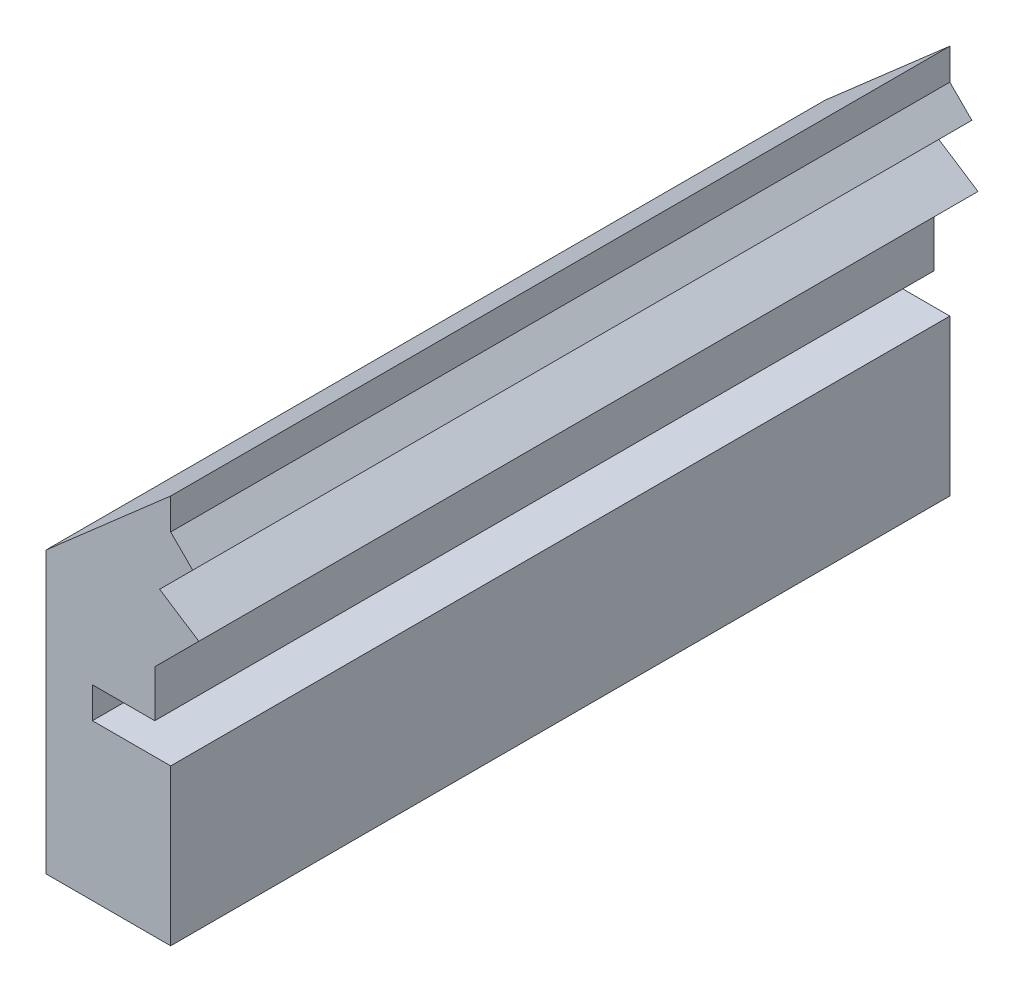
ISO-10303-21;
HEADER;
FILE_DESCRIPTION(('STEP AP214'),'2;1');
FILE_NAME('part.step','',(''),(''),'','','');
FILE_SCHEMA(('AUTOMOTIVE_DESIGN { 1 0 10303 214 1 1 1 1 }'));
ENDSEC;
DATA;
#1=APPLICATION_CONTEXT('core data for automotive mechanical design processes');
#2=APPLICATION_PROTOCOL_DEFINITION('international standard','automotive_design',2000,#1);
#3=PRODUCT_CONTEXT('',#1,'mechanical');
#4=PRODUCT('Part','Part','',(#3));
#5=PRODUCT_RELATED_PRODUCT_CATEGORY('part','',(#4));
#6=PRODUCT_DEFINITION_FORMATION('','',#4);
#7=PRODUCT_DEFINITION_CONTEXT('part definition',#1,'design');
#8=PRODUCT_DEFINITION('design','',#6,#7);
#9=PRODUCT_DEFINITION_SHAPE('','',#8);
#10=(LENGTH_UNIT() NAMED_UNIT(*) SI_UNIT(.MILLI.,.METRE.));
#11=(NAMED_UNIT(*) PLANE_ANGLE_UNIT() SI_UNIT($,.RADIAN.));
#12=(NAMED_UNIT(*) SI_UNIT($,.STERADIAN.) SOLID_ANGLE_UNIT());
#13=UNCERTAINTY_MEASURE_WITH_UNIT(LENGTH_MEASURE(1.E-05),#10,'distance_accuracy_value','');
#14=(GEOMETRIC_REPRESENTATION_CONTEXT(3) GLOBAL_UNCERTAINTY_ASSIGNED_CONTEXT((#13)) GLOBAL_UNIT_ASSIGNED_CONTEXT((#10,
#11,#12)) REPRESENTATION_CONTEXT('',''));
#15=CARTESIAN_POINT('',(0.,0.,0.));
#16=DIRECTION('',(0.,0.,1.));
#17=DIRECTION('',(1.,0.,0.));
#18=AXIS2_PLACEMENT_3D('',#15,#16,#17);
#19=CARTESIAN_POINT('',(-40.,-35.,250.));
#20=DIRECTION('',(0.658504607868518,-0.752576694706878,0.));
#21=DIRECTION('',(0.752576694706878,0.658504607868518,0.));
#22=AXIS2_PLACEMENT_3D('',#19,#20,#21);
#23=PLANE('',#22);
#24=DIRECTION('',(-0.752576694706878,-0.658504607868518,0.));
#25=VECTOR('',#24,1.);
#26=CARTESIAN_POINT('',(-40.,-35.,0.));
#27=LINE('',#26,#25);
#28=CARTESIAN_POINT('',(0.,0.,0.));
#29=VERTEX_POINT('',#28);
#30=CARTESIAN_POINT('',(-40.,-35.,0.));
#31=VERTEX_POINT('',#30);
#32=EDGE_CURVE('E159',#29,#31,#27,.T.);
#33=ORIENTED_EDGE('',*,*,#32,.T.);
#34=DIRECTION('',(0.,0.,-1.));
#35=VECTOR('',#34,1.);
#36=CARTESIAN_POINT('',(-40.,-35.,250.));
#37=LINE('',#36,#35);
#38=CARTESIAN_POINT('',(-40.,-35.,250.));
#39=VERTEX_POINT('',#38);
#40=EDGE_CURVE('E11',#39,#31,#37,.T.);
#41=ORIENTED_EDGE('',*,*,#40,.F.);
#42=DIRECTION('',(-0.752576694706878,-0.658504607868518,0.));
#43=VECTOR('',#42,1.);
#44=CARTESIAN_POINT('',(-40.,-35.,250.));
#45=LINE('',#44,#43);
#46=CARTESIAN_POINT('',(0.,0.,250.));
#47=VERTEX_POINT('',#46);
#48=EDGE_CURVE('E183',#47,#39,#45,.T.);
#49=ORIENTED_EDGE('',*,*,#48,.F.);
#50=DIRECTION('',(0.,0.,-1.));
#51=VECTOR('',#50,1.);
#52=CARTESIAN_POINT('',(0.,0.,250.));
#53=LINE('',#52,#51);
#54=EDGE_CURVE('E155',#47,#29,#53,.T.);
#55=ORIENTED_EDGE('',*,*,#54,.T.);
#56=EDGE_LOOP('',(#33,#41,#49,#55));
#57=FACE_BOUND('',#56,.T.);
#58=ADVANCED_FACE('F33',(#57),#23,.F.);
#59=CARTESIAN_POINT('',(-40.,-125.,250.));
#60=DIRECTION('',(1.,0.,0.));
#61=DIRECTION('',(0.,0.,-1.));
#62=AXIS2_PLACEMENT_3D('',#59,#60,#61);
#63=PLANE('',#62);
#64=DIRECTION('',(0.,-1.,0.));
#65=VECTOR('',#64,1.);
#66=CARTESIAN_POINT('',(-40.,-125.,0.));
#67=LINE('',#66,#65);
#68=CARTESIAN_POINT('',(-40.,-125.,0.));
#69=VERTEX_POINT('',#68);
#70=EDGE_CURVE('E162',#31,#69,#67,.T.);
#71=ORIENTED_EDGE('',*,*,#70,.T.);
#72=DIRECTION('',(0.,0.,-1.));
#73=VECTOR('',#72,1.);
#74=CARTESIAN_POINT('',(-40.,-125.,250.));
#75=LINE('',#74,#73);
#76=CARTESIAN_POINT('',(-40.,-125.,250.));
#77=VERTEX_POINT('',#76);
#78=EDGE_CURVE('E41',#77,#69,#75,.T.);
#79=ORIENTED_EDGE('',*,*,#78,.F.);
#80=DIRECTION('',(0.,-1.,0.));
#81=VECTOR('',#80,1.);
#82=CARTESIAN_POINT('',(-40.,-125.,250.));
#83=LINE('',#82,#81);
#84=EDGE_CURVE('E107',#39,#77,#83,.T.);
#85=ORIENTED_EDGE('',*,*,#84,.F.);
#86=ORIENTED_EDGE('',*,*,#40,.T.);
#87=EDGE_LOOP('',(#71,#79,#85,#86));
#88=FACE_BOUND('',#87,.T.);
#89=ADVANCED_FACE('F266',(#88),#63,.F.);
#90=CARTESIAN_POINT('',(0.,-125.,250.));
#91=DIRECTION('',(0.,1.,0.));
#92=DIRECTION('',(0.,0.,1.));
#93=AXIS2_PLACEMENT_3D('',#90,#91,#92);
#94=PLANE('',#93);
#95=DIRECTION('',(1.,0.,0.));
#96=VECTOR('',#95,1.);
#97=CARTESIAN_POINT('',(0.,-125.,0.));
#98=LINE('',#97,#96);
#99=CARTESIAN_POINT('',(0.,-125.,0.));
#100=VERTEX_POINT('',#99);
#101=EDGE_CURVE('E164',#69,#100,#98,.T.);
#102=ORIENTED_EDGE('',*,*,#101,.T.);
#103=DIRECTION('',(0.,0.,-1.));
#104=VECTOR('',#103,1.);
#105=CARTESIAN_POINT('',(0.,-125.,250.));
#106=LINE('',#105,#104);
#107=CARTESIAN_POINT('',(0.,-125.,250.));
#108=VERTEX_POINT('',#107);
#109=EDGE_CURVE('E205',#108,#100,#106,.T.);
#110=ORIENTED_EDGE('',*,*,#109,.F.);
#111=DIRECTION('',(1.,0.,0.));
#112=VECTOR('',#111,1.);
#113=CARTESIAN_POINT('',(0.,-125.,250.));
#114=LINE('',#113,#112);
#115=EDGE_CURVE('E213',#77,#108,#114,.T.);
#116=ORIENTED_EDGE('',*,*,#115,.F.);
#117=ORIENTED_EDGE('',*,*,#78,.T.);
#118=EDGE_LOOP('',(#102,#110,#116,#117));
#119=FACE_BOUND('',#118,.T.);
#120=ADVANCED_FACE('F211',(#119),#94,.F.);
#121=CARTESIAN_POINT('',(0.,-75.,250.));
#122=DIRECTION('',(-1.,0.,0.));
#123=DIRECTION('',(0.,-1.,0.));
#124=AXIS2_PLACEMENT_3D('',#121,#122,#123);
#125=PLANE('',#124);
#126=DIRECTION('',(0.,1.,0.));
#127=VECTOR('',#126,1.);
#128=CARTESIAN_POINT('',(0.,-75.,0.));
#129=LINE('',#128,#127);
#130=CARTESIAN_POINT('',(0.,-75.,0.));
#131=VERTEX_POINT('',#130);
#132=EDGE_CURVE('E166',#100,#131,#129,.T.);
#133=ORIENTED_EDGE('',*,*,#132,.T.);
#134=DIRECTION('',(0.,0.,-1.));
#135=VECTOR('',#134,1.);
#136=CARTESIAN_POINT('',(0.,-75.,250.));
#137=LINE('',#136,#135);
#138=CARTESIAN_POINT('',(0.,-75.,250.));
#139=VERTEX_POINT('',#138);
#140=EDGE_CURVE('E202',#139,#131,#137,.T.);
#141=ORIENTED_EDGE('',*,*,#140,.F.);
#142=DIRECTION('',(0.,1.,0.));
#143=VECTOR('',#142,1.);
#144=CARTESIAN_POINT('',(0.,-75.,250.));
#145=LINE('',#144,#143);
#146=EDGE_CURVE('E231',#108,#139,#145,.T.);
#147=ORIENTED_EDGE('',*,*,#146,.F.);
#148=ORIENTED_EDGE('',*,*,#109,.T.);
#149=EDGE_LOOP('',(#133,#141,#147,#148));
#150=FACE_BOUND('',#149,.T.);
#151=ADVANCED_FACE('F222',(#150),#125,.F.);
#152=CARTESIAN_POINT('',(-25.1045071481636,-75.,250.));
#153=DIRECTION('',(0.,-1.,0.));
#154=DIRECTION('',(1.,0.,0.));
#155=AXIS2_PLACEMENT_3D('',#152,#153,#154);
#156=PLANE('',#155);
#157=DIRECTION('',(-1.,0.,0.));
#158=VECTOR('',#157,1.);
#159=CARTESIAN_POINT('',(-25.1045071481636,-75.,0.));
#160=LINE('',#159,#158);
#161=CARTESIAN_POINT('',(-25.1045071481636,-75.,0.));
#162=VERTEX_POINT('',#161);
#163=EDGE_CURVE('E168',#131,#162,#160,.T.);
#164=ORIENTED_EDGE('',*,*,#163,.T.);
#165=DIRECTION('',(0.,0.,-1.));
#166=VECTOR('',#165,1.);
#167=CARTESIAN_POINT('',(-25.1045071481636,-75.,250.));
#168=LINE('',#167,#166);
#169=CARTESIAN_POINT('',(-25.1045071481636,-75.,250.));
#170=VERTEX_POINT('',#169);
#171=EDGE_CURVE('E199',#170,#162,#168,.T.);
#172=ORIENTED_EDGE('',*,*,#171,.F.);
#173=DIRECTION('',(-1.,0.,0.));
#174=VECTOR('',#173,1.);
#175=CARTESIAN_POINT('',(-25.1045071481636,-75.,250.));
#176=LINE('',#175,#174);
#177=EDGE_CURVE('E228',#139,#170,#176,.T.);
#178=ORIENTED_EDGE('',*,*,#177,.F.);
#179=ORIENTED_EDGE('',*,*,#140,.T.);
#180=EDGE_LOOP('',(#164,#172,#178,#179));
#181=FACE_BOUND('',#180,.T.);
#182=ADVANCED_FACE('F226',(#181),#156,.F.);
#183=CARTESIAN_POINT('',(-25.1045071481636,-65.,250.));
#184=DIRECTION('',(-1.,0.,0.));
#185=DIRECTION('',(0.,0.,1.));
#186=AXIS2_PLACEMENT_3D('',#183,#184,#185);
#187=PLANE('',#186);
#188=DIRECTION('',(0.,1.,0.));
#189=VECTOR('',#188,1.);
#190=CARTESIAN_POINT('',(-25.1045071481636,-65.,0.));
#191=LINE('',#190,#189);
#192=CARTESIAN_POINT('',(-25.1045071481636,-65.,0.));
#193=VERTEX_POINT('',#192);
#194=EDGE_CURVE('E170',#162,#193,#191,.T.);
#195=ORIENTED_EDGE('',*,*,#194,.T.);
#196=DIRECTION('',(0.,0.,-1.));
#197=VECTOR('',#196,1.);
#198=CARTESIAN_POINT('',(-25.1045071481636,-65.,250.));
#199=LINE('',#198,#197);
#200=CARTESIAN_POINT('',(-25.1045071481636,-65.,250.));
#201=VERTEX_POINT('',#200);
#202=EDGE_CURVE('E196',#201,#193,#199,.T.);
#203=ORIENTED_EDGE('',*,*,#202,.F.);
#204=DIRECTION('',(0.,1.,0.));
#205=VECTOR('',#204,1.);
#206=CARTESIAN_POINT('',(-25.1045071481636,-65.,250.));
#207=LINE('',#206,#205);
#208=EDGE_CURVE('E230',#170,#201,#207,.T.);
#209=ORIENTED_EDGE('',*,*,#208,.F.);
#210=ORIENTED_EDGE('',*,*,#171,.T.);
#211=EDGE_LOOP('',(#195,#203,#209,#210));
#212=FACE_BOUND('',#211,.T.);
#213=ADVANCED_FACE('F279',(#212),#187,.F.);
#214=CARTESIAN_POINT('',(-5.10450714816356,-65.,250.));
#215=DIRECTION('',(0.,1.,0.));
#216=DIRECTION('',(0.,0.,1.));
#217=AXIS2_PLACEMENT_3D('',#214,#215,#216);
#218=PLANE('',#217);
#219=DIRECTION('',(1.,0.,0.));
#220=VECTOR('',#219,1.);
#221=CARTESIAN_POINT('',(-5.10450714816356,-65.,0.));
#222=LINE('',#221,#220);
#223=CARTESIAN_POINT('',(-5.10450714816356,-65.,0.));
#224=VERTEX_POINT('',#223);
#225=EDGE_CURVE('E172',#193,#224,#222,.T.);
#226=ORIENTED_EDGE('',*,*,#225,.T.);
#227=DIRECTION('',(0.,0.,-1.));
#228=VECTOR('',#227,1.);
#229=CARTESIAN_POINT('',(-5.10450714816356,-65.,250.));
#230=LINE('',#229,#228);
#231=CARTESIAN_POINT('',(-5.10450714816356,-65.,250.));
#232=VERTEX_POINT('',#231);
#233=EDGE_CURVE('E193',#232,#224,#230,.T.);
#234=ORIENTED_EDGE('',*,*,#233,.F.);
#235=DIRECTION('',(1.,0.,0.));
#236=VECTOR('',#235,1.);
#237=CARTESIAN_POINT('',(-5.10450714816356,-65.,250.));
#238=LINE('',#237,#236);
#239=EDGE_CURVE('E233',#201,#232,#238,.T.);
#240=ORIENTED_EDGE('',*,*,#239,.F.);
#241=ORIENTED_EDGE('',*,*,#202,.T.);
#242=EDGE_LOOP('',(#226,#234,#240,#241));
#243=FACE_BOUND('',#242,.T.);
#244=ADVANCED_FACE('F282',(#243),#218,.F.);
#245=CARTESIAN_POINT('',(-5.10450714816356,-50.,250.));
#246=DIRECTION('',(-1.,0.,0.));
#247=DIRECTION('',(0.,-1.,0.));
#248=AXIS2_PLACEMENT_3D('',#245,#246,#247);
#249=PLANE('',#248);
#250=DIRECTION('',(0.,1.,0.));
#251=VECTOR('',#250,1.);
#252=CARTESIAN_POINT('',(-5.10450714816356,-50.,0.));
#253=LINE('',#252,#251);
#254=CARTESIAN_POINT('',(-5.10450714816356,-50.,0.));
#255=VERTEX_POINT('',#254);
#256=EDGE_CURVE('E174',#224,#255,#253,.T.);
#257=ORIENTED_EDGE('',*,*,#256,.T.);
#258=DIRECTION('',(0.,0.,-1.));
#259=VECTOR('',#258,1.);
#260=CARTESIAN_POINT('',(-5.10450714816356,-50.,250.));
#261=LINE('',#260,#259);
#262=CARTESIAN_POINT('',(-5.10450714816356,-50.,250.));
#263=VERTEX_POINT('',#262);
#264=EDGE_CURVE('E190',#263,#255,#261,.T.);
#265=ORIENTED_EDGE('',*,*,#264,.F.);
#266=DIRECTION('',(0.,1.,0.));
#267=VECTOR('',#266,1.);
#268=CARTESIAN_POINT('',(-5.10450714816356,-50.,250.));
#269=LINE('',#268,#267);
#270=EDGE_CURVE('E239',#232,#263,#269,.T.);
#271=ORIENTED_EDGE('',*,*,#270,.F.);
#272=ORIENTED_EDGE('',*,*,#233,.T.);
#273=EDGE_LOOP('',(#257,#265,#271,#272));
#274=FACE_BOUND('',#273,.T.);
#275=ADVANCED_FACE('F286',(#274),#249,.F.);
#276=CARTESIAN_POINT('',(9.03762847556741,-35.8578643762691,250.));
#277=DIRECTION('',(-0.707106781186547,0.707106781186548,0.));
#278=DIRECTION('',(-0.707106781186548,-0.707106781186547,0.));
#279=AXIS2_PLACEMENT_3D('',#276,#277,#278);
#280=PLANE('',#279);
#281=DIRECTION('',(0.707106781186548,0.707106781186547,0.));
#282=VECTOR('',#281,1.);
#283=CARTESIAN_POINT('',(9.03762847556741,-35.8578643762691,0.));
#284=LINE('',#283,#282);
#285=CARTESIAN_POINT('',(9.03762847556741,-35.8578643762691,0.));
#286=VERTEX_POINT('',#285);
#287=EDGE_CURVE('E176',#255,#286,#284,.T.);
#288=ORIENTED_EDGE('',*,*,#287,.T.);
#289=DIRECTION('',(0.,0.,-1.));
#290=VECTOR('',#289,1.);
#291=CARTESIAN_POINT('',(9.03762847556741,-35.8578643762691,250.));
#292=LINE('',#291,#290);
#293=CARTESIAN_POINT('',(9.03762847556741,-35.8578643762691,250.));
#294=VERTEX_POINT('',#293);
#295=EDGE_CURVE('E187',#294,#286,#292,.T.);
#296=ORIENTED_EDGE('',*,*,#295,.F.);
#297=DIRECTION('',(0.707106781186548,0.707106781186547,0.));
#298=VECTOR('',#297,1.);
#299=CARTESIAN_POINT('',(9.03762847556741,-35.8578643762691,250.));
#300=LINE('',#299,#298);
#301=EDGE_CURVE('E241',#263,#294,#300,.T.);
#302=ORIENTED_EDGE('',*,*,#301,.F.);
#303=ORIENTED_EDGE('',*,*,#264,.T.);
#304=EDGE_LOOP('',(#288,#296,#302,#303));
#305=FACE_BOUND('',#304,.T.);
#306=ADVANCED_FACE('F247',(#305),#280,.F.);
#307=CARTESIAN_POINT('',(-3.53553390593273,-27.6776695296636,250.));
#308=DIRECTION('',(-0.545346323107029,-0.838210825433342,0.));
#309=DIRECTION('',(0.838210825433342,-0.545346323107029,0.));
#310=AXIS2_PLACEMENT_3D('',#307,#308,#309);
#311=PLANE('',#310);
#312=DIRECTION('',(-0.838210825433342,0.545346323107028,0.));
#313=VECTOR('',#312,1.);
#314=CARTESIAN_POINT('',(-3.53553390593273,-27.6776695296636,0.));
#315=LINE('',#314,#313);
#316=CARTESIAN_POINT('',(-3.53553390593273,-27.6776695296636,0.));
#317=VERTEX_POINT('',#316);
#318=EDGE_CURVE('E178',#286,#317,#315,.T.);
#319=ORIENTED_EDGE('',*,*,#318,.T.);
#320=DIRECTION('',(0.,0.,-1.));
#321=VECTOR('',#320,1.);
#322=CARTESIAN_POINT('',(-3.53553390593273,-27.6776695296636,250.));
#323=LINE('',#322,#321);
#324=CARTESIAN_POINT('',(-3.53553390593273,-27.6776695296636,250.));
#325=VERTEX_POINT('',#324);
#326=EDGE_CURVE('E150',#325,#317,#323,.T.);
#327=ORIENTED_EDGE('',*,*,#326,.F.);
#328=DIRECTION('',(-0.838210825433342,0.545346323107028,0.));
#329=VECTOR('',#328,1.);
#330=CARTESIAN_POINT('',(-3.53553390593273,-27.6776695296636,250.));
#331=LINE('',#330,#329);
#332=EDGE_CURVE('E141',#294,#325,#331,.T.);
#333=ORIENTED_EDGE('',*,*,#332,.F.);
#334=ORIENTED_EDGE('',*,*,#295,.T.);
#335=EDGE_LOOP('',(#319,#327,#333,#334));
#336=FACE_BOUND('',#335,.T.);
#337=ADVANCED_FACE('F251',(#336),#311,.F.);
#338=CARTESIAN_POINT('',(7.07106781186549,-17.0710678118655,250.));
#339=DIRECTION('',(-0.707106781186546,0.707106781186549,0.));
#340=DIRECTION('',(-0.707106781186549,-0.707106781186546,0.));
#341=AXIS2_PLACEMENT_3D('',#338,#339,#340);
#342=PLANE('',#341);
#343=DIRECTION('',(0.707106781186549,0.707106781186546,0.));
#344=VECTOR('',#343,1.);
#345=CARTESIAN_POINT('',(7.07106781186549,-17.0710678118655,0.));
#346=LINE('',#345,#344);
#347=CARTESIAN_POINT('',(7.07106781186549,-17.0710678118655,0.));
#348=VERTEX_POINT('',#347);
#349=EDGE_CURVE('E149',#317,#348,#346,.T.);
#350=ORIENTED_EDGE('',*,*,#349,.T.);
#351=DIRECTION('',(0.,0.,-1.));
#352=VECTOR('',#351,1.);
#353=CARTESIAN_POINT('',(7.07106781186549,-17.0710678118655,250.));
#354=LINE('',#353,#352);
#355=CARTESIAN_POINT('',(7.07106781186549,-17.0710678118655,250.));
#356=VERTEX_POINT('',#355);
#357=EDGE_CURVE('E146',#356,#348,#354,.T.);
#358=ORIENTED_EDGE('',*,*,#357,.F.);
#359=DIRECTION('',(0.707106781186549,0.707106781186546,0.));
#360=VECTOR('',#359,1.);
#361=CARTESIAN_POINT('',(7.07106781186549,-17.0710678118655,250.));
#362=LINE('',#361,#360);
#363=EDGE_CURVE('E135',#325,#356,#362,.T.);
#364=ORIENTED_EDGE('',*,*,#363,.F.);
#365=ORIENTED_EDGE('',*,*,#326,.T.);
#366=EDGE_LOOP('',(#350,#358,#364,#365));
#367=FACE_BOUND('',#366,.T.);
#368=ADVANCED_FACE('F147',(#367),#342,.F.);
#369=CARTESIAN_POINT('',(0.,-10.,250.));
#370=DIRECTION('',(-0.707106781186546,-0.707106781186549,0.));
#371=DIRECTION('',(0.707106781186549,-0.707106781186546,0.));
#372=AXIS2_PLACEMENT_3D('',#369,#370,#371);
#373=PLANE('',#372);
#374=DIRECTION('',(-0.707106781186549,0.707106781186546,0.));
#375=VECTOR('',#374,1.);
#376=CARTESIAN_POINT('',(0.,-10.,0.));
#377=LINE('',#376,#375);
#378=CARTESIAN_POINT('',(0.,-10.,0.));
#379=VERTEX_POINT('',#378);
#380=EDGE_CURVE('E93',#348,#379,#377,.T.);
#381=ORIENTED_EDGE('',*,*,#380,.T.);
#382=DIRECTION('',(0.,0.,-1.));
#383=VECTOR('',#382,1.);
#384=CARTESIAN_POINT('',(0.,-10.,250.));
#385=LINE('',#384,#383);
#386=CARTESIAN_POINT('',(0.,-10.,250.));
#387=VERTEX_POINT('',#386);
#388=EDGE_CURVE('E151',#387,#379,#385,.T.);
#389=ORIENTED_EDGE('',*,*,#388,.F.);
#390=DIRECTION('',(-0.707106781186549,0.707106781186546,0.));
#391=VECTOR('',#390,1.);
#392=CARTESIAN_POINT('',(0.,-10.,250.));
#393=LINE('',#392,#391);
#394=EDGE_CURVE('E139',#356,#387,#393,.T.);
#395=ORIENTED_EDGE('',*,*,#394,.F.);
#396=ORIENTED_EDGE('',*,*,#357,.T.);
#397=EDGE_LOOP('',(#381,#389,#395,#396));
#398=FACE_BOUND('',#397,.T.);
#399=ADVANCED_FACE('F153',(#398),#373,.F.);
#400=CARTESIAN_POINT('',(0.,0.,250.));
#401=DIRECTION('',(-1.,0.,0.));
#402=DIRECTION('',(0.,0.,1.));
#403=AXIS2_PLACEMENT_3D('',#400,#401,#402);
#404=PLANE('',#403);
#405=DIRECTION('',(0.,1.,0.));
#406=VECTOR('',#405,1.);
#407=CARTESIAN_POINT('',(0.,0.,0.));
#408=LINE('',#407,#406);
#409=EDGE_CURVE('E99',#379,#29,#408,.T.);
#410=ORIENTED_EDGE('',*,*,#409,.T.);
#411=ORIENTED_EDGE('',*,*,#54,.F.);
#412=DIRECTION('',(0.,1.,0.));
#413=VECTOR('',#412,1.);
#414=CARTESIAN_POINT('',(0.,0.,250.));
#415=LINE('',#414,#413);
#416=EDGE_CURVE('E49',#387,#47,#415,.T.);
#417=ORIENTED_EDGE('',*,*,#416,.F.);
#418=ORIENTED_EDGE('',*,*,#388,.T.);
#419=EDGE_LOOP('',(#410,#411,#417,#418));
#420=FACE_BOUND('',#419,.T.);
#421=ADVANCED_FACE('F255',(#420),#404,.F.);
#422=CARTESIAN_POINT('',(0.,0.,250.));
#423=DIRECTION('',(0.,0.,-1.));
#424=DIRECTION('',(-1.,0.,0.));
#425=AXIS2_PLACEMENT_3D('',#422,#423,#424);
#426=PLANE('',#425);
#427=ORIENTED_EDGE('',*,*,#48,.T.);
#428=ORIENTED_EDGE('',*,*,#84,.T.);
#429=ORIENTED_EDGE('',*,*,#115,.T.);
#430=ORIENTED_EDGE('',*,*,#146,.T.);
#431=ORIENTED_EDGE('',*,*,#177,.T.);
#432=ORIENTED_EDGE('',*,*,#208,.T.);
#433=ORIENTED_EDGE('',*,*,#239,.T.);
#434=ORIENTED_EDGE('',*,*,#270,.T.);
#435=ORIENTED_EDGE('',*,*,#301,.T.);
#436=ORIENTED_EDGE('',*,*,#332,.T.);
#437=ORIENTED_EDGE('',*,*,#363,.T.);
#438=ORIENTED_EDGE('',*,*,#394,.T.);
#439=ORIENTED_EDGE('',*,*,#416,.T.);
#440=EDGE_LOOP('',(#427,#428,#429,#430,#431,#432,#433,#434,#435,#436,#437,#438,#439));
#441=FACE_BOUND('',#440,.T.);
#442=ADVANCED_FACE('F137',(#441),#426,.F.);
#443=CARTESIAN_POINT('',(0.,0.,0.));
#444=DIRECTION('',(0.,0.,-1.));
#445=DIRECTION('',(-1.,0.,0.));
#446=AXIS2_PLACEMENT_3D('',#443,#444,#445);
#447=PLANE('',#446);
#448=ORIENTED_EDGE('',*,*,#32,.F.);
#449=ORIENTED_EDGE('',*,*,#409,.F.);
#450=ORIENTED_EDGE('',*,*,#380,.F.);
#451=ORIENTED_EDGE('',*,*,#349,.F.);
#452=ORIENTED_EDGE('',*,*,#318,.F.);
#453=ORIENTED_EDGE('',*,*,#287,.F.);
#454=ORIENTED_EDGE('',*,*,#256,.F.);
#455=ORIENTED_EDGE('',*,*,#225,.F.);
#456=ORIENTED_EDGE('',*,*,#194,.F.);
#457=ORIENTED_EDGE('',*,*,#163,.F.);
#458=ORIENTED_EDGE('',*,*,#132,.F.);
#459=ORIENTED_EDGE('',*,*,#101,.F.);
#460=ORIENTED_EDGE('',*,*,#70,.F.);
#461=EDGE_LOOP('',(#448,#449,#450,#451,#452,#453,#454,#455,#456,#457,#458,#459,#460));
#462=FACE_BOUND('',#461,.T.);
#463=ADVANCED_FACE('F217',(#462),#447,.T.);
#464=CLOSED_SHELL('',(#58,#89,#120,#151,#182,#213,#244,#275,#306,#337,#368,#399,#421,#442,#463));
#465=MANIFOLD_SOLID_BREP('B2',#464);
#466=ADVANCED_BREP_SHAPE_REPRESENTATION('',(#18,#465),#14);
#467=SHAPE_DEFINITION_REPRESENTATION(#9,#466);
ENDSEC;
END-ISO-10303-21;
